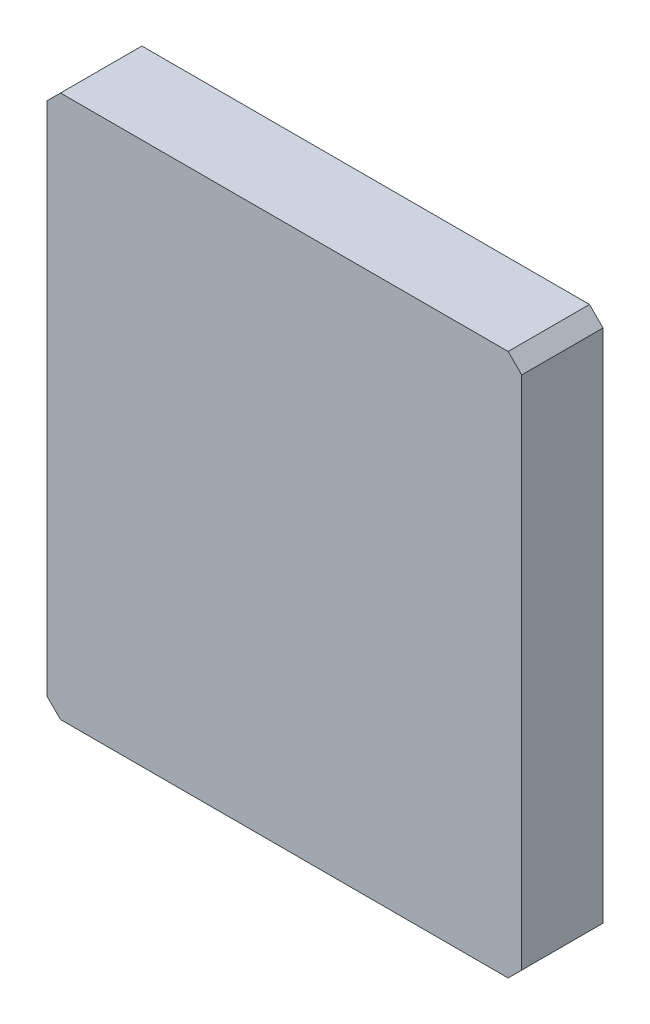
ISO-10303-21;
HEADER;
FILE_DESCRIPTION(('STEP AP214'),'2;1');
FILE_NAME('part.step','',(''),(''),'','','');
FILE_SCHEMA(('AUTOMOTIVE_DESIGN { 1 0 10303 214 1 1 1 1 }'));
ENDSEC;
DATA;
#1=APPLICATION_CONTEXT('core data for automotive mechanical design processes');
#2=APPLICATION_PROTOCOL_DEFINITION('international standard','automotive_design',2000,#1);
#3=PRODUCT_CONTEXT('',#1,'mechanical');
#4=PRODUCT('Part','Part','',(#3));
#5=PRODUCT_RELATED_PRODUCT_CATEGORY('part','',(#4));
#6=PRODUCT_DEFINITION_FORMATION('','',#4);
#7=PRODUCT_DEFINITION_CONTEXT('part definition',#1,'design');
#8=PRODUCT_DEFINITION('design','',#6,#7);
#9=PRODUCT_DEFINITION_SHAPE('','',#8);
#10=(LENGTH_UNIT() NAMED_UNIT(*) SI_UNIT(.MILLI.,.METRE.));
#11=(NAMED_UNIT(*) PLANE_ANGLE_UNIT() SI_UNIT($,.RADIAN.));
#12=(NAMED_UNIT(*) SI_UNIT($,.STERADIAN.) SOLID_ANGLE_UNIT());
#13=UNCERTAINTY_MEASURE_WITH_UNIT(LENGTH_MEASURE(1.E-05),#10,'distance_accuracy_value','');
#14=(GEOMETRIC_REPRESENTATION_CONTEXT(3) GLOBAL_UNCERTAINTY_ASSIGNED_CONTEXT((#13)) GLOBAL_UNIT_ASSIGNED_CONTEXT((#10,
#11,#12)) REPRESENTATION_CONTEXT('',''));
#15=CARTESIAN_POINT('',(0.,0.,0.));
#16=DIRECTION('',(0.,0.,1.));
#17=DIRECTION('',(1.,0.,0.));
#18=AXIS2_PLACEMENT_3D('',#15,#16,#17);
#19=CARTESIAN_POINT('',(8.75,10.,-3.));
#20=DIRECTION('',(1.,0.,0.));
#21=DIRECTION('',(0.,0.,-1.));
#22=AXIS2_PLACEMENT_3D('',#19,#20,#21);
#23=PLANE('',#22);
#24=DIRECTION('',(0.,1.,0.));
#25=VECTOR('',#24,1.);
#26=CARTESIAN_POINT('',(8.75,10.,-3.));
#27=LINE('',#26,#25);
#28=CARTESIAN_POINT('',(8.75,-9.5,-3.));
#29=VERTEX_POINT('',#28);
#30=CARTESIAN_POINT('',(8.75,9.5,-3.));
#31=VERTEX_POINT('',#30);
#32=EDGE_CURVE('E196',#29,#31,#27,.T.);
#33=ORIENTED_EDGE('',*,*,#32,.T.);
#34=DIRECTION('',(0.,0.,1.));
#35=VECTOR('',#34,1.);
#36=CARTESIAN_POINT('',(8.75,9.5,-3.));
#37=LINE('',#36,#35);
#38=CARTESIAN_POINT('',(8.75,9.5,0.));
#39=VERTEX_POINT('',#38);
#40=EDGE_CURVE('E156',#31,#39,#37,.T.);
#41=ORIENTED_EDGE('',*,*,#40,.T.);
#42=DIRECTION('',(0.,1.,0.));
#43=VECTOR('',#42,1.);
#44=CARTESIAN_POINT('',(8.75,10.,0.));
#45=LINE('',#44,#43);
#46=CARTESIAN_POINT('',(8.75,-9.5,0.));
#47=VERTEX_POINT('',#46);
#48=EDGE_CURVE('E187',#47,#39,#45,.T.);
#49=ORIENTED_EDGE('',*,*,#48,.F.);
#50=DIRECTION('',(0.,0.,-1.));
#51=VECTOR('',#50,1.);
#52=CARTESIAN_POINT('',(8.75,-9.5,-3.));
#53=LINE('',#52,#51);
#54=EDGE_CURVE('E150',#47,#29,#53,.T.);
#55=ORIENTED_EDGE('',*,*,#54,.T.);
#56=EDGE_LOOP('',(#33,#41,#49,#55));
#57=FACE_BOUND('',#56,.T.);
#58=ADVANCED_FACE('F45',(#57),#23,.T.);
#59=CARTESIAN_POINT('',(-8.75,-10.,-3.));
#60=DIRECTION('',(0.,-1.,0.));
#61=DIRECTION('',(0.,0.,-1.));
#62=AXIS2_PLACEMENT_3D('',#59,#60,#61);
#63=PLANE('',#62);
#64=DIRECTION('',(1.,0.,0.));
#65=VECTOR('',#64,1.);
#66=CARTESIAN_POINT('',(-8.75,-10.,-3.));
#67=LINE('',#66,#65);
#68=CARTESIAN_POINT('',(-8.25,-10.,-3.));
#69=VERTEX_POINT('',#68);
#70=CARTESIAN_POINT('',(8.25,-10.,-3.));
#71=VERTEX_POINT('',#70);
#72=EDGE_CURVE('E131',#69,#71,#67,.T.);
#73=ORIENTED_EDGE('',*,*,#72,.T.);
#74=DIRECTION('',(0.,0.,1.));
#75=VECTOR('',#74,1.);
#76=CARTESIAN_POINT('',(8.25,-10.,-3.));
#77=LINE('',#76,#75);
#78=CARTESIAN_POINT('',(8.25,-10.,0.));
#79=VERTEX_POINT('',#78);
#80=EDGE_CURVE('E143',#71,#79,#77,.T.);
#81=ORIENTED_EDGE('',*,*,#80,.T.);
#82=DIRECTION('',(1.,0.,0.));
#83=VECTOR('',#82,1.);
#84=CARTESIAN_POINT('',(-8.75,-10.,0.));
#85=LINE('',#84,#83);
#86=CARTESIAN_POINT('',(-8.25,-10.,0.));
#87=VERTEX_POINT('',#86);
#88=EDGE_CURVE('E115',#87,#79,#85,.T.);
#89=ORIENTED_EDGE('',*,*,#88,.F.);
#90=DIRECTION('',(0.,0.,-1.));
#91=VECTOR('',#90,1.);
#92=CARTESIAN_POINT('',(-8.25,-10.,-3.));
#93=LINE('',#92,#91);
#94=EDGE_CURVE('E124',#87,#69,#93,.T.);
#95=ORIENTED_EDGE('',*,*,#94,.T.);
#96=EDGE_LOOP('',(#73,#81,#89,#95));
#97=FACE_BOUND('',#96,.T.);
#98=ADVANCED_FACE('F205',(#97),#63,.T.);
#99=CARTESIAN_POINT('',(-8.75,10.,-3.));
#100=DIRECTION('',(-1.,0.,0.));
#101=DIRECTION('',(0.,-1.,0.));
#102=AXIS2_PLACEMENT_3D('',#99,#100,#101);
#103=PLANE('',#102);
#104=DIRECTION('',(0.,-1.,0.));
#105=VECTOR('',#104,1.);
#106=CARTESIAN_POINT('',(-8.75,10.,0.));
#107=LINE('',#106,#105);
#108=CARTESIAN_POINT('',(-8.75,9.5,0.));
#109=VERTEX_POINT('',#108);
#110=CARTESIAN_POINT('',(-8.75,-9.49999999999999,0.));
#111=VERTEX_POINT('',#110);
#112=EDGE_CURVE('E107',#109,#111,#107,.T.);
#113=ORIENTED_EDGE('',*,*,#112,.F.);
#114=DIRECTION('',(0.,0.,-1.));
#115=VECTOR('',#114,1.);
#116=CARTESIAN_POINT('',(-8.75,9.5,-3.));
#117=LINE('',#116,#115);
#118=CARTESIAN_POINT('',(-8.75,9.5,-3.));
#119=VERTEX_POINT('',#118);
#120=EDGE_CURVE('E55',#109,#119,#117,.T.);
#121=ORIENTED_EDGE('',*,*,#120,.T.);
#122=DIRECTION('',(0.,-1.,0.));
#123=VECTOR('',#122,1.);
#124=CARTESIAN_POINT('',(-8.75,10.,-3.));
#125=LINE('',#124,#123);
#126=CARTESIAN_POINT('',(-8.75,-9.49999999999999,-3.));
#127=VERTEX_POINT('',#126);
#128=EDGE_CURVE('E128',#119,#127,#125,.T.);
#129=ORIENTED_EDGE('',*,*,#128,.T.);
#130=DIRECTION('',(0.,0.,1.));
#131=VECTOR('',#130,1.);
#132=CARTESIAN_POINT('',(-8.75,-9.49999999999999,-3.));
#133=LINE('',#132,#131);
#134=EDGE_CURVE('E123',#127,#111,#133,.T.);
#135=ORIENTED_EDGE('',*,*,#134,.T.);
#136=EDGE_LOOP('',(#113,#121,#129,#135));
#137=FACE_BOUND('',#136,.T.);
#138=ADVANCED_FACE('F127',(#137),#103,.T.);
#139=CARTESIAN_POINT('',(-8.75,10.,-3.));
#140=DIRECTION('',(0.,1.,0.));
#141=DIRECTION('',(0.,0.,1.));
#142=AXIS2_PLACEMENT_3D('',#139,#140,#141);
#143=PLANE('',#142);
#144=DIRECTION('',(-1.,0.,0.));
#145=VECTOR('',#144,1.);
#146=CARTESIAN_POINT('',(-8.75,10.,-3.));
#147=LINE('',#146,#145);
#148=CARTESIAN_POINT('',(8.25,10.,-3.));
#149=VERTEX_POINT('',#148);
#150=CARTESIAN_POINT('',(-8.25,10.,-3.));
#151=VERTEX_POINT('',#150);
#152=EDGE_CURVE('E182',#149,#151,#147,.T.);
#153=ORIENTED_EDGE('',*,*,#152,.T.);
#154=DIRECTION('',(0.,0.,1.));
#155=VECTOR('',#154,1.);
#156=CARTESIAN_POINT('',(-8.25,10.,-3.));
#157=LINE('',#156,#155);
#158=CARTESIAN_POINT('',(-8.25,10.,0.));
#159=VERTEX_POINT('',#158);
#160=EDGE_CURVE('E169',#151,#159,#157,.T.);
#161=ORIENTED_EDGE('',*,*,#160,.T.);
#162=DIRECTION('',(-1.,0.,0.));
#163=VECTOR('',#162,1.);
#164=CARTESIAN_POINT('',(-8.75,10.,0.));
#165=LINE('',#164,#163);
#166=CARTESIAN_POINT('',(8.25,10.,0.));
#167=VERTEX_POINT('',#166);
#168=EDGE_CURVE('E116',#167,#159,#165,.T.);
#169=ORIENTED_EDGE('',*,*,#168,.F.);
#170=DIRECTION('',(0.,0.,-1.));
#171=VECTOR('',#170,1.);
#172=CARTESIAN_POINT('',(8.25,10.,-3.));
#173=LINE('',#172,#171);
#174=EDGE_CURVE('E163',#167,#149,#173,.T.);
#175=ORIENTED_EDGE('',*,*,#174,.T.);
#176=EDGE_LOOP('',(#153,#161,#169,#175));
#177=FACE_BOUND('',#176,.T.);
#178=ADVANCED_FACE('F179',(#177),#143,.T.);
#179=CARTESIAN_POINT('',(0.,0.,-3.));
#180=DIRECTION('',(0.,0.,1.));
#181=DIRECTION('',(1.,0.,0.));
#182=AXIS2_PLACEMENT_3D('',#179,#180,#181);
#183=PLANE('',#182);
#184=ORIENTED_EDGE('',*,*,#128,.F.);
#185=DIRECTION('',(-0.707106781186548,-0.707106781186548,0.));
#186=VECTOR('',#185,1.);
#187=CARTESIAN_POINT('',(-8.25,10.,-3.));
#188=LINE('',#187,#186);
#189=EDGE_CURVE('E11',#119,#151,#188,.F.);
#190=ORIENTED_EDGE('',*,*,#189,.T.);
#191=ORIENTED_EDGE('',*,*,#152,.F.);
#192=DIRECTION('',(-0.707106781186548,0.707106781186548,0.));
#193=VECTOR('',#192,1.);
#194=CARTESIAN_POINT('',(8.75,9.5,-3.));
#195=LINE('',#194,#193);
#196=EDGE_CURVE('E166',#149,#31,#195,.F.);
#197=ORIENTED_EDGE('',*,*,#196,.T.);
#198=ORIENTED_EDGE('',*,*,#32,.F.);
#199=DIRECTION('',(0.707106781186548,0.707106781186548,0.));
#200=VECTOR('',#199,1.);
#201=CARTESIAN_POINT('',(8.25,-10.,-3.));
#202=LINE('',#201,#200);
#203=EDGE_CURVE('E153',#29,#71,#202,.F.);
#204=ORIENTED_EDGE('',*,*,#203,.T.);
#205=ORIENTED_EDGE('',*,*,#72,.F.);
#206=DIRECTION('',(0.707106781186548,-0.707106781186548,0.));
#207=VECTOR('',#206,1.);
#208=CARTESIAN_POINT('',(-8.75,-9.49999999999999,-3.));
#209=LINE('',#208,#207);
#210=EDGE_CURVE('E140',#69,#127,#209,.F.);
#211=ORIENTED_EDGE('',*,*,#210,.T.);
#212=EDGE_LOOP('',(#184,#190,#191,#197,#198,#204,#205,#211));
#213=FACE_BOUND('',#212,.T.);
#214=ADVANCED_FACE('F213',(#213),#183,.F.);
#215=CARTESIAN_POINT('',(0.,0.,0.));
#216=DIRECTION('',(0.,0.,1.));
#217=DIRECTION('',(1.,0.,0.));
#218=AXIS2_PLACEMENT_3D('',#215,#216,#217);
#219=PLANE('',#218);
#220=ORIENTED_EDGE('',*,*,#168,.T.);
#221=DIRECTION('',(0.707106781186548,0.707106781186548,0.));
#222=VECTOR('',#221,1.);
#223=CARTESIAN_POINT('',(-9.125,9.125,0.));
#224=LINE('',#223,#222);
#225=EDGE_CURVE('E69',#159,#109,#224,.F.);
#226=ORIENTED_EDGE('',*,*,#225,.T.);
#227=ORIENTED_EDGE('',*,*,#112,.T.);
#228=DIRECTION('',(-0.707106781186548,0.707106781186548,0.));
#229=VECTOR('',#228,1.);
#230=CARTESIAN_POINT('',(-9.125,-9.125,0.));
#231=LINE('',#230,#229);
#232=EDGE_CURVE('E111',#111,#87,#231,.F.);
#233=ORIENTED_EDGE('',*,*,#232,.T.);
#234=ORIENTED_EDGE('',*,*,#88,.T.);
#235=DIRECTION('',(-0.707106781186548,-0.707106781186548,0.));
#236=VECTOR('',#235,1.);
#237=CARTESIAN_POINT('',(9.125,-9.125,0.));
#238=LINE('',#237,#236);
#239=EDGE_CURVE('E147',#79,#47,#238,.F.);
#240=ORIENTED_EDGE('',*,*,#239,.T.);
#241=ORIENTED_EDGE('',*,*,#48,.T.);
#242=DIRECTION('',(0.707106781186548,-0.707106781186548,0.));
#243=VECTOR('',#242,1.);
#244=CARTESIAN_POINT('',(9.125,9.125,0.));
#245=LINE('',#244,#243);
#246=EDGE_CURVE('E160',#39,#167,#245,.F.);
#247=ORIENTED_EDGE('',*,*,#246,.T.);
#248=EDGE_LOOP('',(#220,#226,#227,#233,#234,#240,#241,#247));
#249=FACE_BOUND('',#248,.T.);
#250=ADVANCED_FACE('F109',(#249),#219,.T.);
#251=CARTESIAN_POINT('',(-8.75,-9.49999999999999,-3.));
#252=DIRECTION('',(0.707106781186547,0.707106781186547,0.));
#253=DIRECTION('',(0.,0.,1.));
#254=AXIS2_PLACEMENT_3D('',#251,#252,#253);
#255=PLANE('',#254);
#256=ORIENTED_EDGE('',*,*,#210,.F.);
#257=ORIENTED_EDGE('',*,*,#94,.F.);
#258=ORIENTED_EDGE('',*,*,#232,.F.);
#259=ORIENTED_EDGE('',*,*,#134,.F.);
#260=EDGE_LOOP('',(#256,#257,#258,#259));
#261=FACE_BOUND('',#260,.T.);
#262=ADVANCED_FACE('F122',(#261),#255,.F.);
#263=CARTESIAN_POINT('',(8.25,-10.,-3.));
#264=DIRECTION('',(-0.707106781186547,0.707106781186547,0.));
#265=DIRECTION('',(0.,0.,1.));
#266=AXIS2_PLACEMENT_3D('',#263,#264,#265);
#267=PLANE('',#266);
#268=ORIENTED_EDGE('',*,*,#203,.F.);
#269=ORIENTED_EDGE('',*,*,#54,.F.);
#270=ORIENTED_EDGE('',*,*,#239,.F.);
#271=ORIENTED_EDGE('',*,*,#80,.F.);
#272=EDGE_LOOP('',(#268,#269,#270,#271));
#273=FACE_BOUND('',#272,.T.);
#274=ADVANCED_FACE('F210',(#273),#267,.F.);
#275=CARTESIAN_POINT('',(8.75,9.5,-3.));
#276=DIRECTION('',(-0.707106781186547,-0.707106781186547,0.));
#277=DIRECTION('',(0.,0.,1.));
#278=AXIS2_PLACEMENT_3D('',#275,#276,#277);
#279=PLANE('',#278);
#280=ORIENTED_EDGE('',*,*,#196,.F.);
#281=ORIENTED_EDGE('',*,*,#174,.F.);
#282=ORIENTED_EDGE('',*,*,#246,.F.);
#283=ORIENTED_EDGE('',*,*,#40,.F.);
#284=EDGE_LOOP('',(#280,#281,#282,#283));
#285=FACE_BOUND('',#284,.T.);
#286=ADVANCED_FACE('F216',(#285),#279,.F.);
#287=CARTESIAN_POINT('',(-8.25,10.,-3.));
#288=DIRECTION('',(0.707106781186547,-0.707106781186547,0.));
#289=DIRECTION('',(0.,0.,1.));
#290=AXIS2_PLACEMENT_3D('',#287,#288,#289);
#291=PLANE('',#290);
#292=ORIENTED_EDGE('',*,*,#189,.F.);
#293=ORIENTED_EDGE('',*,*,#120,.F.);
#294=ORIENTED_EDGE('',*,*,#225,.F.);
#295=ORIENTED_EDGE('',*,*,#160,.F.);
#296=EDGE_LOOP('',(#292,#293,#294,#295));
#297=FACE_BOUND('',#296,.T.);
#298=ADVANCED_FACE('F48',(#297),#291,.F.);
#299=CLOSED_SHELL('',(#58,#98,#138,#178,#214,#250,#262,#274,#286,#298));
#300=MANIFOLD_SOLID_BREP('B2',#299);
#301=ADVANCED_BREP_SHAPE_REPRESENTATION('',(#18,#300),#14);
#302=SHAPE_DEFINITION_REPRESENTATION(#9,#301);
ENDSEC;
END-ISO-10303-21;
